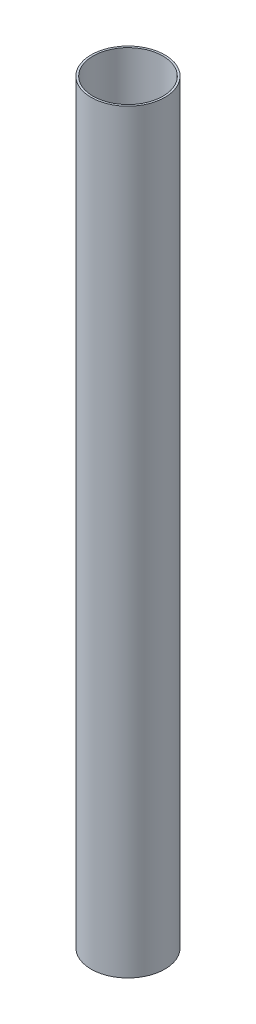
ISO-10303-21;
HEADER;
FILE_DESCRIPTION(('STEP AP214'),'2;1');
FILE_NAME('part.step','',(''),(''),'','','');
FILE_SCHEMA(('AUTOMOTIVE_DESIGN { 1 0 10303 214 1 1 1 1 }'));
ENDSEC;
DATA;
#1=APPLICATION_CONTEXT('core data for automotive mechanical design processes');
#2=APPLICATION_PROTOCOL_DEFINITION('international standard','automotive_design',2000,#1);
#3=PRODUCT_CONTEXT('',#1,'mechanical');
#4=PRODUCT('Part','Part','',(#3));
#5=PRODUCT_RELATED_PRODUCT_CATEGORY('part','',(#4));
#6=PRODUCT_DEFINITION_FORMATION('','',#4);
#7=PRODUCT_DEFINITION_CONTEXT('part definition',#1,'design');
#8=PRODUCT_DEFINITION('design','',#6,#7);
#9=PRODUCT_DEFINITION_SHAPE('','',#8);
#10=(LENGTH_UNIT() NAMED_UNIT(*) SI_UNIT(.MILLI.,.METRE.));
#11=(NAMED_UNIT(*) PLANE_ANGLE_UNIT() SI_UNIT($,.RADIAN.));
#12=(NAMED_UNIT(*) SI_UNIT($,.STERADIAN.) SOLID_ANGLE_UNIT());
#13=UNCERTAINTY_MEASURE_WITH_UNIT(LENGTH_MEASURE(1.E-05),#10,'distance_accuracy_value','');
#14=(GEOMETRIC_REPRESENTATION_CONTEXT(3) GLOBAL_UNCERTAINTY_ASSIGNED_CONTEXT((#13)) GLOBAL_UNIT_ASSIGNED_CONTEXT((#10,
#11,#12)) REPRESENTATION_CONTEXT('',''));
#15=CARTESIAN_POINT('',(0.,0.,0.));
#16=DIRECTION('',(0.,0.,1.));
#17=DIRECTION('',(1.,0.,0.));
#18=AXIS2_PLACEMENT_3D('',#15,#16,#17);
#19=CARTESIAN_POINT('',(0.,520.192,0.));
#20=DIRECTION('',(0.,1.,0.));
#21=DIRECTION('',(0.,0.,1.));
#22=AXIS2_PLACEMENT_3D('',#19,#20,#21);
#23=PLANE('',#22);
#24=CARTESIAN_POINT('',(0.,520.192,0.));
#25=DIRECTION('',(0.,1.,0.));
#26=DIRECTION('',(0.,0.,1.));
#27=AXIS2_PLACEMENT_3D('',#24,#25,#26);
#28=CIRCLE('',#27,25.4);
#29=CARTESIAN_POINT('',(0.,520.192,25.4));
#30=VERTEX_POINT('',#29);
#31=EDGE_CURVE('E11',#30,#30,#28,.T.);
#32=ORIENTED_EDGE('',*,*,#31,.T.);
#33=EDGE_LOOP('',(#32));
#34=FACE_BOUND('',#33,.T.);
#35=CARTESIAN_POINT('',(0.,520.192,0.));
#36=DIRECTION('',(0.,1.,0.));
#37=DIRECTION('',(1.,0.,0.));
#38=AXIS2_PLACEMENT_3D('',#35,#36,#37);
#39=CIRCLE('',#38,24.0538);
#40=CARTESIAN_POINT('',(24.0538,520.192,0.));
#41=VERTEX_POINT('',#40);
#42=EDGE_CURVE('E54',#41,#41,#39,.T.);
#43=ORIENTED_EDGE('',*,*,#42,.F.);
#44=EDGE_LOOP('',(#43));
#45=FACE_BOUND('',#44,.T.);
#46=ADVANCED_FACE('F43',(#34,#45),#23,.T.);
#47=CARTESIAN_POINT('',(0.,0.,0.));
#48=DIRECTION('',(0.,1.,0.));
#49=DIRECTION('',(0.,0.,1.));
#50=AXIS2_PLACEMENT_3D('',#47,#48,#49);
#51=PLANE('',#50);
#52=CARTESIAN_POINT('',(0.,0.,0.));
#53=DIRECTION('',(0.,1.,0.));
#54=DIRECTION('',(0.,0.,1.));
#55=AXIS2_PLACEMENT_3D('',#52,#53,#54);
#56=CIRCLE('',#55,25.4);
#57=CARTESIAN_POINT('',(0.,0.,25.4));
#58=VERTEX_POINT('',#57);
#59=EDGE_CURVE('E47',#58,#58,#56,.T.);
#60=ORIENTED_EDGE('',*,*,#59,.F.);
#61=EDGE_LOOP('',(#60));
#62=FACE_BOUND('',#61,.T.);
#63=CARTESIAN_POINT('',(0.,0.,0.));
#64=DIRECTION('',(0.,1.,0.));
#65=DIRECTION('',(1.,0.,0.));
#66=AXIS2_PLACEMENT_3D('',#63,#64,#65);
#67=CIRCLE('',#66,24.0538);
#68=CARTESIAN_POINT('',(24.0538,0.,0.));
#69=VERTEX_POINT('',#68);
#70=EDGE_CURVE('E56',#69,#69,#67,.T.);
#71=ORIENTED_EDGE('',*,*,#70,.T.);
#72=EDGE_LOOP('',(#71));
#73=FACE_BOUND('',#72,.T.);
#74=ADVANCED_FACE('F66',(#62,#73),#51,.F.);
#75=CARTESIAN_POINT('',(0.,520.192,0.));
#76=DIRECTION('',(0.,-1.,0.));
#77=DIRECTION('',(0.,0.,-1.));
#78=AXIS2_PLACEMENT_3D('',#75,#76,#77);
#79=CYLINDRICAL_SURFACE('',#78,25.4);
#80=ORIENTED_EDGE('',*,*,#31,.F.);
#81=EDGE_LOOP('',(#80));
#82=FACE_BOUND('',#81,.T.);
#83=ORIENTED_EDGE('',*,*,#59,.T.);
#84=EDGE_LOOP('',(#83));
#85=FACE_BOUND('',#84,.T.);
#86=ADVANCED_FACE('F45',(#82,#85),#79,.T.);
#87=CARTESIAN_POINT('',(0.,520.192,0.));
#88=DIRECTION('',(0.,-1.,0.));
#89=DIRECTION('',(0.,0.,-1.));
#90=AXIS2_PLACEMENT_3D('',#87,#88,#89);
#91=CYLINDRICAL_SURFACE('',#90,24.0538);
#92=ORIENTED_EDGE('',*,*,#42,.T.);
#93=EDGE_LOOP('',(#92));
#94=FACE_BOUND('',#93,.T.);
#95=ORIENTED_EDGE('',*,*,#70,.F.);
#96=EDGE_LOOP('',(#95));
#97=FACE_BOUND('',#96,.T.);
#98=ADVANCED_FACE('F62',(#94,#97),#91,.F.);
#99=CLOSED_SHELL('',(#46,#74,#86,#98));
#100=MANIFOLD_SOLID_BREP('B2',#99);
#101=ADVANCED_BREP_SHAPE_REPRESENTATION('',(#18,#100),#14);
#102=SHAPE_DEFINITION_REPRESENTATION(#9,#101);
ENDSEC;
END-ISO-10303-21;
